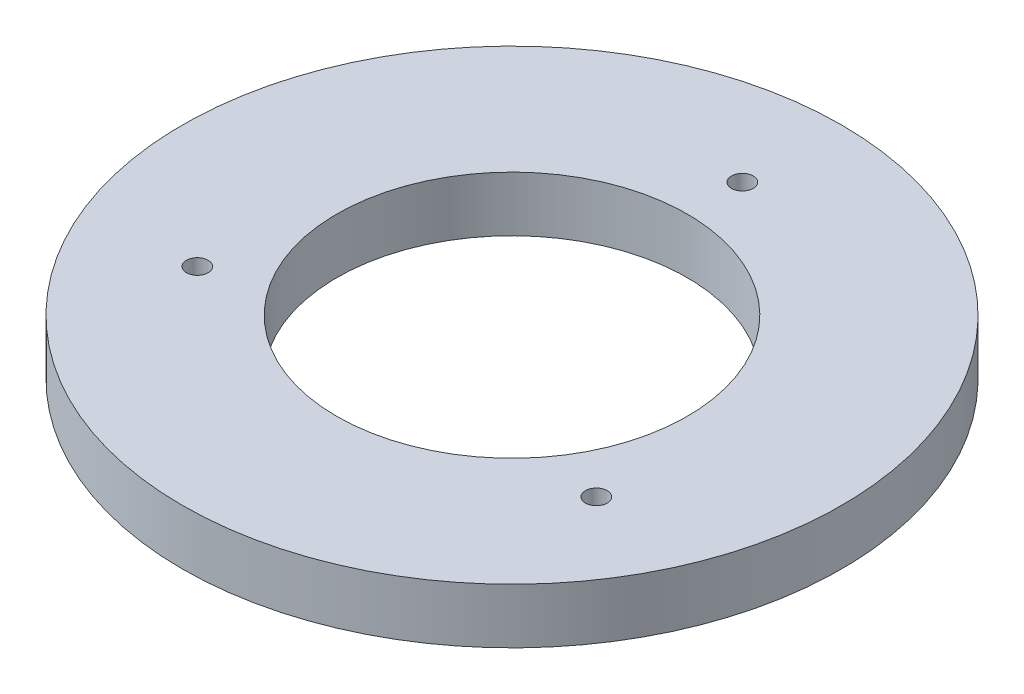
ISO-10303-21;
HEADER;
FILE_DESCRIPTION(('STEP AP214'),'2;1');
FILE_NAME('part.step','',(''),(''),'','','');
FILE_SCHEMA(('AUTOMOTIVE_DESIGN { 1 0 10303 214 1 1 1 1 }'));
ENDSEC;
DATA;
#1=APPLICATION_CONTEXT('core data for automotive mechanical design processes');
#2=APPLICATION_PROTOCOL_DEFINITION('international standard','automotive_design',2000,#1);
#3=PRODUCT_CONTEXT('',#1,'mechanical');
#4=PRODUCT('Part','Part','',(#3));
#5=PRODUCT_RELATED_PRODUCT_CATEGORY('part','',(#4));
#6=PRODUCT_DEFINITION_FORMATION('','',#4);
#7=PRODUCT_DEFINITION_CONTEXT('part definition',#1,'design');
#8=PRODUCT_DEFINITION('design','',#6,#7);
#9=PRODUCT_DEFINITION_SHAPE('','',#8);
#10=(LENGTH_UNIT() NAMED_UNIT(*) SI_UNIT(.MILLI.,.METRE.));
#11=(NAMED_UNIT(*) PLANE_ANGLE_UNIT() SI_UNIT($,.RADIAN.));
#12=(NAMED_UNIT(*) SI_UNIT($,.STERADIAN.) SOLID_ANGLE_UNIT());
#13=UNCERTAINTY_MEASURE_WITH_UNIT(LENGTH_MEASURE(1.E-05),#10,'distance_accuracy_value','');
#14=(GEOMETRIC_REPRESENTATION_CONTEXT(3) GLOBAL_UNCERTAINTY_ASSIGNED_CONTEXT((#13)) GLOBAL_UNIT_ASSIGNED_CONTEXT((#10,
#11,#12)) REPRESENTATION_CONTEXT('',''));
#15=CARTESIAN_POINT('',(0.,0.,0.));
#16=DIRECTION('',(0.,0.,1.));
#17=DIRECTION('',(1.,0.,0.));
#18=AXIS2_PLACEMENT_3D('',#15,#16,#17);
#19=CARTESIAN_POINT('',(0.,3.175,0.));
#20=DIRECTION('',(0.,1.,0.));
#21=DIRECTION('',(0.,0.,1.));
#22=AXIS2_PLACEMENT_3D('',#19,#20,#21);
#23=PLANE('',#22);
#24=CARTESIAN_POINT('',(-22.987,3.175,13.2715506378619));
#25=DIRECTION('',(0.,1.,0.));
#26=DIRECTION('',(0.,0.,1.));
#27=AXIS2_PLACEMENT_3D('',#24,#25,#26);
#28=CIRCLE('',#27,1.25);
#29=CARTESIAN_POINT('',(-22.987,3.175,14.5215506378619));
#30=VERTEX_POINT('',#29);
#31=EDGE_CURVE('E67',#30,#30,#28,.T.);
#32=ORIENTED_EDGE('',*,*,#31,.F.);
#33=EDGE_LOOP('',(#32));
#34=FACE_BOUND('',#33,.T.);
#35=CARTESIAN_POINT('',(0.,3.175,-26.5431012757239));
#36=DIRECTION('',(0.,1.,0.));
#37=DIRECTION('',(0.,0.,1.));
#38=AXIS2_PLACEMENT_3D('',#35,#36,#37);
#39=CIRCLE('',#38,1.25);
#40=CARTESIAN_POINT('',(0.,3.175,-25.2931012757239));
#41=VERTEX_POINT('',#40);
#42=EDGE_CURVE('E61',#41,#41,#39,.T.);
#43=ORIENTED_EDGE('',*,*,#42,.F.);
#44=EDGE_LOOP('',(#43));
#45=FACE_BOUND('',#44,.T.);
#46=CARTESIAN_POINT('',(22.987,3.175,13.2715506378619));
#47=DIRECTION('',(0.,1.,0.));
#48=DIRECTION('',(0.,0.,1.));
#49=AXIS2_PLACEMENT_3D('',#46,#47,#48);
#50=CIRCLE('',#49,1.25);
#51=CARTESIAN_POINT('',(22.987,3.175,14.5215506378619));
#52=VERTEX_POINT('',#51);
#53=EDGE_CURVE('E55',#52,#52,#50,.T.);
#54=ORIENTED_EDGE('',*,*,#53,.F.);
#55=EDGE_LOOP('',(#54));
#56=FACE_BOUND('',#55,.T.);
#57=CARTESIAN_POINT('',(0.,3.175,0.));
#58=DIRECTION('',(0.,1.,0.));
#59=DIRECTION('',(0.,0.,1.));
#60=AXIS2_PLACEMENT_3D('',#57,#58,#59);
#61=CIRCLE('',#60,37.973);
#62=CARTESIAN_POINT('',(0.,3.175,37.973));
#63=VERTEX_POINT('',#62);
#64=EDGE_CURVE('E10',#63,#63,#61,.T.);
#65=ORIENTED_EDGE('',*,*,#64,.T.);
#66=EDGE_LOOP('',(#65));
#67=FACE_BOUND('',#66,.T.);
#68=CARTESIAN_POINT('',(0.,3.175,0.));
#69=DIRECTION('',(0.,1.,0.));
#70=DIRECTION('',(0.,0.,1.));
#71=AXIS2_PLACEMENT_3D('',#68,#69,#70);
#72=CIRCLE('',#71,20.193);
#73=CARTESIAN_POINT('',(0.,3.175,20.193));
#74=VERTEX_POINT('',#73);
#75=EDGE_CURVE('E47',#74,#74,#72,.T.);
#76=ORIENTED_EDGE('',*,*,#75,.F.);
#77=EDGE_LOOP('',(#76));
#78=FACE_BOUND('',#77,.T.);
#79=ADVANCED_FACE('F36',(#34,#45,#56,#67,#78),#23,.T.);
#80=CARTESIAN_POINT('',(0.,-3.175,0.));
#81=DIRECTION('',(0.,1.,0.));
#82=DIRECTION('',(0.,0.,1.));
#83=AXIS2_PLACEMENT_3D('',#80,#81,#82);
#84=PLANE('',#83);
#85=CARTESIAN_POINT('',(-22.987,-3.175,13.2715506378619));
#86=DIRECTION('',(0.,1.,0.));
#87=DIRECTION('',(0.,0.,1.));
#88=AXIS2_PLACEMENT_3D('',#85,#86,#87);
#89=CIRCLE('',#88,1.25);
#90=CARTESIAN_POINT('',(-22.987,-3.175,14.5215506378619));
#91=VERTEX_POINT('',#90);
#92=EDGE_CURVE('E52',#91,#91,#89,.T.);
#93=ORIENTED_EDGE('',*,*,#92,.T.);
#94=EDGE_LOOP('',(#93));
#95=FACE_BOUND('',#94,.T.);
#96=CARTESIAN_POINT('',(0.,-3.175,-26.5431012757239));
#97=DIRECTION('',(0.,1.,0.));
#98=DIRECTION('',(0.,0.,1.));
#99=AXIS2_PLACEMENT_3D('',#96,#97,#98);
#100=CIRCLE('',#99,1.25);
#101=CARTESIAN_POINT('',(0.,-3.175,-25.2931012757239));
#102=VERTEX_POINT('',#101);
#103=EDGE_CURVE('E64',#102,#102,#100,.T.);
#104=ORIENTED_EDGE('',*,*,#103,.T.);
#105=EDGE_LOOP('',(#104));
#106=FACE_BOUND('',#105,.T.);
#107=CARTESIAN_POINT('',(22.987,-3.175,13.2715506378619));
#108=DIRECTION('',(0.,1.,0.));
#109=DIRECTION('',(0.,0.,1.));
#110=AXIS2_PLACEMENT_3D('',#107,#108,#109);
#111=CIRCLE('',#110,1.25);
#112=CARTESIAN_POINT('',(22.987,-3.175,14.5215506378619));
#113=VERTEX_POINT('',#112);
#114=EDGE_CURVE('E58',#113,#113,#111,.T.);
#115=ORIENTED_EDGE('',*,*,#114,.T.);
#116=EDGE_LOOP('',(#115));
#117=FACE_BOUND('',#116,.T.);
#118=CARTESIAN_POINT('',(0.,-3.175,0.));
#119=DIRECTION('',(0.,1.,0.));
#120=DIRECTION('',(0.,0.,1.));
#121=AXIS2_PLACEMENT_3D('',#118,#119,#120);
#122=CIRCLE('',#121,37.973);
#123=CARTESIAN_POINT('',(0.,-3.175,37.973));
#124=VERTEX_POINT('',#123);
#125=EDGE_CURVE('E40',#124,#124,#122,.T.);
#126=ORIENTED_EDGE('',*,*,#125,.F.);
#127=EDGE_LOOP('',(#126));
#128=FACE_BOUND('',#127,.T.);
#129=CARTESIAN_POINT('',(0.,-3.175,0.));
#130=DIRECTION('',(0.,1.,0.));
#131=DIRECTION('',(0.,0.,1.));
#132=AXIS2_PLACEMENT_3D('',#129,#130,#131);
#133=CIRCLE('',#132,20.193);
#134=CARTESIAN_POINT('',(0.,-3.175,20.193));
#135=VERTEX_POINT('',#134);
#136=EDGE_CURVE('E49',#135,#135,#133,.T.);
#137=ORIENTED_EDGE('',*,*,#136,.T.);
#138=EDGE_LOOP('',(#137));
#139=FACE_BOUND('',#138,.T.);
#140=ADVANCED_FACE('F73',(#95,#106,#117,#128,#139),#84,.F.);
#141=CARTESIAN_POINT('',(0.,3.175,0.));
#142=DIRECTION('',(0.,-1.,0.));
#143=DIRECTION('',(0.,0.,-1.));
#144=AXIS2_PLACEMENT_3D('',#141,#142,#143);
#145=CYLINDRICAL_SURFACE('',#144,37.973);
#146=ORIENTED_EDGE('',*,*,#64,.F.);
#147=EDGE_LOOP('',(#146));
#148=FACE_BOUND('',#147,.T.);
#149=ORIENTED_EDGE('',*,*,#125,.T.);
#150=EDGE_LOOP('',(#149));
#151=FACE_BOUND('',#150,.T.);
#152=ADVANCED_FACE('F38',(#148,#151),#145,.T.);
#153=CARTESIAN_POINT('',(0.,3.175,0.));
#154=DIRECTION('',(0.,-1.,0.));
#155=DIRECTION('',(0.,0.,-1.));
#156=AXIS2_PLACEMENT_3D('',#153,#154,#155);
#157=CYLINDRICAL_SURFACE('',#156,20.193);
#158=ORIENTED_EDGE('',*,*,#75,.T.);
#159=EDGE_LOOP('',(#158));
#160=FACE_BOUND('',#159,.T.);
#161=ORIENTED_EDGE('',*,*,#136,.F.);
#162=EDGE_LOOP('',(#161));
#163=FACE_BOUND('',#162,.T.);
#164=ADVANCED_FACE('F92',(#160,#163),#157,.F.);
#165=CARTESIAN_POINT('',(22.987,-3.175,13.2715506378619));
#166=DIRECTION('',(0.,1.,0.));
#167=DIRECTION('',(0.,0.,1.));
#168=AXIS2_PLACEMENT_3D('',#165,#166,#167);
#169=CYLINDRICAL_SURFACE('',#168,1.25);
#170=ORIENTED_EDGE('',*,*,#114,.F.);
#171=EDGE_LOOP('',(#170));
#172=FACE_BOUND('',#171,.T.);
#173=ORIENTED_EDGE('',*,*,#53,.T.);
#174=EDGE_LOOP('',(#173));
#175=FACE_BOUND('',#174,.T.);
#176=ADVANCED_FACE('F95',(#172,#175),#169,.F.);
#177=CARTESIAN_POINT('',(0.,-3.175,-26.5431012757239));
#178=DIRECTION('',(0.,1.,0.));
#179=DIRECTION('',(0.,0.,1.));
#180=AXIS2_PLACEMENT_3D('',#177,#178,#179);
#181=CYLINDRICAL_SURFACE('',#180,1.25);
#182=ORIENTED_EDGE('',*,*,#103,.F.);
#183=EDGE_LOOP('',(#182));
#184=FACE_BOUND('',#183,.T.);
#185=ORIENTED_EDGE('',*,*,#42,.T.);
#186=EDGE_LOOP('',(#185));
#187=FACE_BOUND('',#186,.T.);
#188=ADVANCED_FACE('F79',(#184,#187),#181,.F.);
#189=CARTESIAN_POINT('',(-22.987,-3.175,13.2715506378619));
#190=DIRECTION('',(0.,1.,0.));
#191=DIRECTION('',(0.,0.,1.));
#192=AXIS2_PLACEMENT_3D('',#189,#190,#191);
#193=CYLINDRICAL_SURFACE('',#192,1.25);
#194=ORIENTED_EDGE('',*,*,#92,.F.);
#195=EDGE_LOOP('',(#194));
#196=FACE_BOUND('',#195,.T.);
#197=ORIENTED_EDGE('',*,*,#31,.T.);
#198=EDGE_LOOP('',(#197));
#199=FACE_BOUND('',#198,.T.);
#200=ADVANCED_FACE('F76',(#196,#199),#193,.F.);
#201=CLOSED_SHELL('',(#79,#140,#152,#164,#176,#188,#200));
#202=MANIFOLD_SOLID_BREP('B2',#201);
#203=ADVANCED_BREP_SHAPE_REPRESENTATION('',(#18,#202),#14);
#204=SHAPE_DEFINITION_REPRESENTATION(#9,#203);
ENDSEC;
END-ISO-10303-21;
